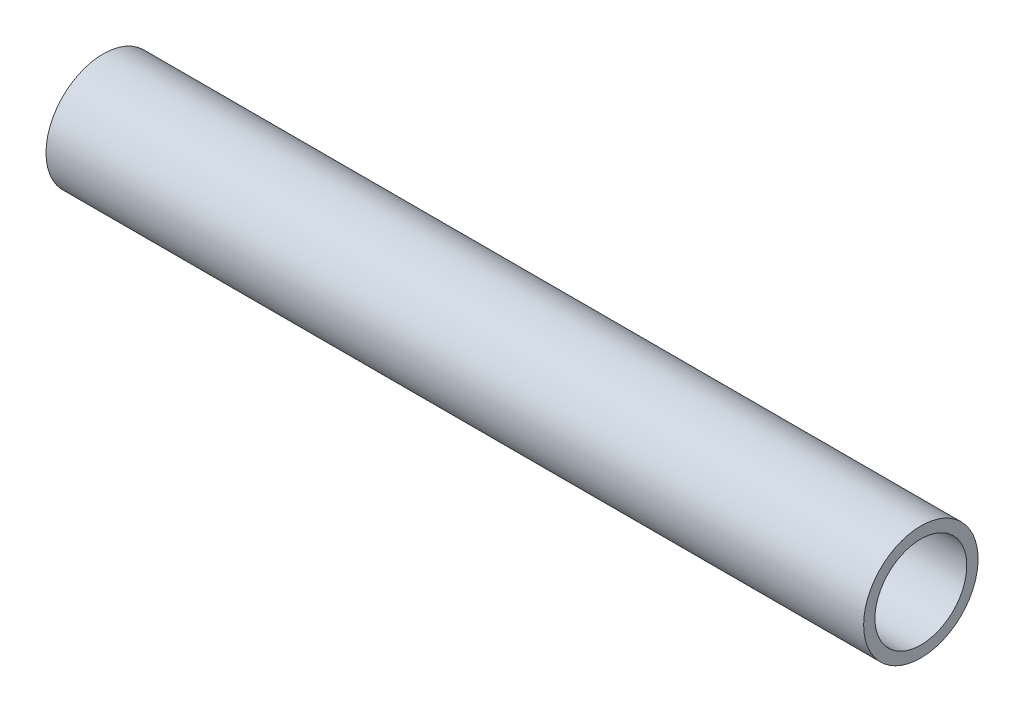
ISO-10303-21;
HEADER;
FILE_DESCRIPTION(('STEP AP214'),'2;1');
FILE_NAME('part.step','',(''),(''),'','','');
FILE_SCHEMA(('AUTOMOTIVE_DESIGN { 1 0 10303 214 1 1 1 1 }'));
ENDSEC;
DATA;
#1=APPLICATION_CONTEXT('core data for automotive mechanical design processes');
#2=APPLICATION_PROTOCOL_DEFINITION('international standard','automotive_design',2000,#1);
#3=PRODUCT_CONTEXT('',#1,'mechanical');
#4=PRODUCT('Part','Part','',(#3));
#5=PRODUCT_RELATED_PRODUCT_CATEGORY('part','',(#4));
#6=PRODUCT_DEFINITION_FORMATION('','',#4);
#7=PRODUCT_DEFINITION_CONTEXT('part definition',#1,'design');
#8=PRODUCT_DEFINITION('design','',#6,#7);
#9=PRODUCT_DEFINITION_SHAPE('','',#8);
#10=(LENGTH_UNIT() NAMED_UNIT(*) SI_UNIT(.MILLI.,.METRE.));
#11=(NAMED_UNIT(*) PLANE_ANGLE_UNIT() SI_UNIT($,.RADIAN.));
#12=(NAMED_UNIT(*) SI_UNIT($,.STERADIAN.) SOLID_ANGLE_UNIT());
#13=UNCERTAINTY_MEASURE_WITH_UNIT(LENGTH_MEASURE(1.E-05),#10,'distance_accuracy_value','');
#14=(GEOMETRIC_REPRESENTATION_CONTEXT(3) GLOBAL_UNCERTAINTY_ASSIGNED_CONTEXT((#13)) GLOBAL_UNIT_ASSIGNED_CONTEXT((#10,
#11,#12)) REPRESENTATION_CONTEXT('',''));
#15=CARTESIAN_POINT('',(0.,0.,0.));
#16=DIRECTION('',(0.,0.,1.));
#17=DIRECTION('',(1.,0.,0.));
#18=AXIS2_PLACEMENT_3D('',#15,#16,#17);
#19=CARTESIAN_POINT('',(76.2,0.,0.));
#20=DIRECTION('',(1.,0.,0.));
#21=DIRECTION('',(0.,0.,-1.));
#22=AXIS2_PLACEMENT_3D('',#19,#20,#21);
#23=PLANE('',#22);
#24=CARTESIAN_POINT('',(76.2,0.,0.));
#25=DIRECTION('',(1.,0.,0.));
#26=DIRECTION('',(0.,0.,-1.));
#27=AXIS2_PLACEMENT_3D('',#24,#25,#26);
#28=CIRCLE('',#27,10.668);
#29=CARTESIAN_POINT('',(76.2,0.,10.668));
#30=VERTEX_POINT('',#29);
#31=EDGE_CURVE('E10',#30,#30,#28,.T.);
#32=ORIENTED_EDGE('',*,*,#31,.T.);
#33=EDGE_LOOP('',(#32));
#34=FACE_BOUND('',#33,.T.);
#35=CARTESIAN_POINT('',(76.2,0.,0.));
#36=DIRECTION('',(1.,0.,0.));
#37=DIRECTION('',(0.,0.,-1.));
#38=AXIS2_PLACEMENT_3D('',#35,#36,#37);
#39=CIRCLE('',#38,8.5598);
#40=CARTESIAN_POINT('',(76.2,0.,8.5598));
#41=VERTEX_POINT('',#40);
#42=EDGE_CURVE('E42',#41,#41,#39,.T.);
#43=ORIENTED_EDGE('',*,*,#42,.F.);
#44=EDGE_LOOP('',(#43));
#45=FACE_BOUND('',#44,.T.);
#46=ADVANCED_FACE('F31',(#34,#45),#23,.T.);
#47=CARTESIAN_POINT('',(-76.2,0.,0.));
#48=DIRECTION('',(1.,0.,0.));
#49=DIRECTION('',(0.,0.,-1.));
#50=AXIS2_PLACEMENT_3D('',#47,#48,#49);
#51=PLANE('',#50);
#52=CARTESIAN_POINT('',(-76.2,0.,0.));
#53=DIRECTION('',(1.,0.,0.));
#54=DIRECTION('',(0.,0.,-1.));
#55=AXIS2_PLACEMENT_3D('',#52,#53,#54);
#56=CIRCLE('',#55,10.668);
#57=CARTESIAN_POINT('',(-76.2,0.,10.668));
#58=VERTEX_POINT('',#57);
#59=EDGE_CURVE('E35',#58,#58,#56,.T.);
#60=ORIENTED_EDGE('',*,*,#59,.F.);
#61=EDGE_LOOP('',(#60));
#62=FACE_BOUND('',#61,.T.);
#63=CARTESIAN_POINT('',(-76.2,0.,0.));
#64=DIRECTION('',(1.,0.,0.));
#65=DIRECTION('',(0.,0.,-1.));
#66=AXIS2_PLACEMENT_3D('',#63,#64,#65);
#67=CIRCLE('',#66,8.5598);
#68=CARTESIAN_POINT('',(-76.2,0.,8.5598));
#69=VERTEX_POINT('',#68);
#70=EDGE_CURVE('E44',#69,#69,#67,.T.);
#71=ORIENTED_EDGE('',*,*,#70,.T.);
#72=EDGE_LOOP('',(#71));
#73=FACE_BOUND('',#72,.T.);
#74=ADVANCED_FACE('F54',(#62,#73),#51,.F.);
#75=CARTESIAN_POINT('',(76.2,0.,0.));
#76=DIRECTION('',(-1.,0.,0.));
#77=DIRECTION('',(0.,0.,1.));
#78=AXIS2_PLACEMENT_3D('',#75,#76,#77);
#79=CYLINDRICAL_SURFACE('',#78,10.668);
#80=CARTESIAN_POINT('',(76.2,0.,10.668));
#81=CARTESIAN_POINT('',(74.6125,0.,10.668));
#82=CARTESIAN_POINT('',(73.025,0.,10.668));
#83=CARTESIAN_POINT('',(69.85,0.,10.668));
#84=CARTESIAN_POINT('',(68.2625,0.,10.668));
#85=CARTESIAN_POINT('',(65.0875,0.,10.668));
#86=CARTESIAN_POINT('',(63.5,0.,10.668));
#87=CARTESIAN_POINT('',(60.325,0.,10.668));
#88=CARTESIAN_POINT('',(58.7375,0.,10.668));
#89=CARTESIAN_POINT('',(55.5625,0.,10.668));
#90=CARTESIAN_POINT('',(53.975,0.,10.668));
#91=CARTESIAN_POINT('',(50.8,0.,10.668));
#92=CARTESIAN_POINT('',(49.2125,0.,10.668));
#93=CARTESIAN_POINT('',(46.0375,0.,10.668));
#94=CARTESIAN_POINT('',(44.45,0.,10.668));
#95=CARTESIAN_POINT('',(41.275,0.,10.668));
#96=CARTESIAN_POINT('',(39.6875,0.,10.668));
#97=CARTESIAN_POINT('',(36.5125,0.,10.668));
#98=CARTESIAN_POINT('',(34.925,0.,10.668));
#99=CARTESIAN_POINT('',(31.75,0.,10.668));
#100=CARTESIAN_POINT('',(30.1625,0.,10.668));
#101=CARTESIAN_POINT('',(26.9875,0.,10.668));
#102=CARTESIAN_POINT('',(25.4,0.,10.668));
#103=CARTESIAN_POINT('',(22.225,0.,10.668));
#104=CARTESIAN_POINT('',(20.6375,0.,10.668));
#105=CARTESIAN_POINT('',(17.4625,0.,10.668));
#106=CARTESIAN_POINT('',(15.875,0.,10.668));
#107=CARTESIAN_POINT('',(12.7,0.,10.668));
#108=CARTESIAN_POINT('',(11.1125,0.,10.668));
#109=CARTESIAN_POINT('',(7.93749999999999,0.,10.668));
#110=CARTESIAN_POINT('',(6.34999999999999,0.,10.668));
#111=CARTESIAN_POINT('',(3.17499999999999,0.,10.668));
#112=CARTESIAN_POINT('',(1.58749999999999,0.,10.668));
#113=CARTESIAN_POINT('',(-1.58750000000001,0.,10.668));
#114=CARTESIAN_POINT('',(-3.17500000000002,0.,10.668));
#115=CARTESIAN_POINT('',(-6.35000000000002,0.,10.668));
#116=CARTESIAN_POINT('',(-7.93750000000002,0.,10.668));
#117=CARTESIAN_POINT('',(-11.1125,0.,10.668));
#118=CARTESIAN_POINT('',(-12.7,0.,10.668));
#119=CARTESIAN_POINT('',(-15.875,0.,10.668));
#120=CARTESIAN_POINT('',(-17.4625,0.,10.668));
#121=CARTESIAN_POINT('',(-20.6375,0.,10.668));
#122=CARTESIAN_POINT('',(-22.225,0.,10.668));
#123=CARTESIAN_POINT('',(-25.4,0.,10.668));
#124=CARTESIAN_POINT('',(-26.9875,0.,10.668));
#125=CARTESIAN_POINT('',(-30.1625,0.,10.668));
#126=CARTESIAN_POINT('',(-31.75,0.,10.668));
#127=CARTESIAN_POINT('',(-34.925,0.,10.668));
#128=CARTESIAN_POINT('',(-36.5125,0.,10.668));
#129=CARTESIAN_POINT('',(-39.6875,0.,10.668));
#130=CARTESIAN_POINT('',(-41.275,0.,10.668));
#131=CARTESIAN_POINT('',(-44.45,0.,10.668));
#132=CARTESIAN_POINT('',(-46.0375,0.,10.668));
#133=CARTESIAN_POINT('',(-49.2125,0.,10.668));
#134=CARTESIAN_POINT('',(-50.8,0.,10.668));
#135=CARTESIAN_POINT('',(-53.975,0.,10.668));
#136=CARTESIAN_POINT('',(-55.5625,0.,10.668));
#137=CARTESIAN_POINT('',(-58.7375,0.,10.668));
#138=CARTESIAN_POINT('',(-60.325,0.,10.668));
#139=CARTESIAN_POINT('',(-63.5,0.,10.668));
#140=CARTESIAN_POINT('',(-65.0875,0.,10.668));
#141=CARTESIAN_POINT('',(-68.2625,0.,10.668));
#142=CARTESIAN_POINT('',(-69.85,0.,10.668));
#143=CARTESIAN_POINT('',(-73.025,0.,10.668));
#144=CARTESIAN_POINT('',(-74.6125,0.,10.668));
#145=CARTESIAN_POINT('',(-76.2,0.,10.668));
#146=B_SPLINE_CURVE_WITH_KNOTS('',3,(#80,#81,#82,#83,#84,#85,#86,#87,#88,#89,#90,#91,#92,#93,
#94,#95,#96,#97,#98,#99,#100,#101,#102,#103,#104,#105,#106,#107,#108,#109,#110,#111,#112,#113,
#114,#115,#116,#117,#118,#119,#120,#121,#122,#123,#124,#125,#126,#127,#128,#129,#130,#131,#132,
#133,#134,#135,#136,#137,#138,#139,#140,#141,#142,#143,#144,#145),.UNSPECIFIED.,.F.,.F.,(4,2,2,
2,2,2,2,2,2,2,2,2,2,2,2,2,2,2,2,2,2,2,2,2,2,2,2,2,2,2,2,2,4),(0.,4.76249999999999,
9.52499999999999,14.2875,19.05,23.8125,28.575,33.3375,38.1,42.8625,47.625,52.3875,57.15,61.9125,
66.675,71.4375,76.2,80.9625,85.725,90.4875,95.25,100.0125,104.775,109.5375,114.3,119.0625,
123.825,128.5875,133.35,138.1125,142.875,147.6375,152.4),.UNSPECIFIED.);
#147=EDGE_CURVE('BSEAM33',#30,#58,#146,.T.);
#148=ORIENTED_EDGE('',*,*,#31,.F.);
#149=ORIENTED_EDGE('',*,*,#59,.T.);
#150=ORIENTED_EDGE('',*,*,#147,.T.);
#151=ORIENTED_EDGE('',*,*,#147,.F.);
#152=EDGE_LOOP('',(#148,#150,#149,#151));
#153=FACE_BOUND('',#152,.T.);
#154=ADVANCED_FACE('F33',(#153),#79,.T.);
#155=CARTESIAN_POINT('',(76.2,0.,0.));
#156=DIRECTION('',(-1.,0.,0.));
#157=DIRECTION('',(0.,0.,1.));
#158=AXIS2_PLACEMENT_3D('',#155,#156,#157);
#159=CYLINDRICAL_SURFACE('',#158,8.5598);
#160=CARTESIAN_POINT('',(76.2,0.,8.5598));
#161=CARTESIAN_POINT('',(74.6125,0.,8.5598));
#162=CARTESIAN_POINT('',(73.025,0.,8.5598));
#163=CARTESIAN_POINT('',(69.85,0.,8.5598));
#164=CARTESIAN_POINT('',(68.2625,0.,8.5598));
#165=CARTESIAN_POINT('',(65.0875,0.,8.5598));
#166=CARTESIAN_POINT('',(63.5,0.,8.5598));
#167=CARTESIAN_POINT('',(60.325,0.,8.5598));
#168=CARTESIAN_POINT('',(58.7375,0.,8.5598));
#169=CARTESIAN_POINT('',(55.5625,0.,8.5598));
#170=CARTESIAN_POINT('',(53.975,0.,8.5598));
#171=CARTESIAN_POINT('',(50.8,0.,8.5598));
#172=CARTESIAN_POINT('',(49.2125,0.,8.5598));
#173=CARTESIAN_POINT('',(46.0375,0.,8.5598));
#174=CARTESIAN_POINT('',(44.45,0.,8.5598));
#175=CARTESIAN_POINT('',(41.275,0.,8.5598));
#176=CARTESIAN_POINT('',(39.6875,0.,8.5598));
#177=CARTESIAN_POINT('',(36.5125,0.,8.5598));
#178=CARTESIAN_POINT('',(34.925,0.,8.5598));
#179=CARTESIAN_POINT('',(31.75,0.,8.5598));
#180=CARTESIAN_POINT('',(30.1625,0.,8.5598));
#181=CARTESIAN_POINT('',(26.9875,0.,8.5598));
#182=CARTESIAN_POINT('',(25.4,0.,8.5598));
#183=CARTESIAN_POINT('',(22.225,0.,8.5598));
#184=CARTESIAN_POINT('',(20.6375,0.,8.5598));
#185=CARTESIAN_POINT('',(17.4625,0.,8.5598));
#186=CARTESIAN_POINT('',(15.875,0.,8.5598));
#187=CARTESIAN_POINT('',(12.7,0.,8.5598));
#188=CARTESIAN_POINT('',(11.1125,0.,8.5598));
#189=CARTESIAN_POINT('',(7.93749999999999,0.,8.5598));
#190=CARTESIAN_POINT('',(6.34999999999999,0.,8.5598));
#191=CARTESIAN_POINT('',(3.17499999999999,0.,8.5598));
#192=CARTESIAN_POINT('',(1.58749999999999,0.,8.5598));
#193=CARTESIAN_POINT('',(-1.58750000000001,0.,8.5598));
#194=CARTESIAN_POINT('',(-3.17500000000002,0.,8.5598));
#195=CARTESIAN_POINT('',(-6.35000000000002,0.,8.5598));
#196=CARTESIAN_POINT('',(-7.93750000000002,0.,8.5598));
#197=CARTESIAN_POINT('',(-11.1125,0.,8.5598));
#198=CARTESIAN_POINT('',(-12.7,0.,8.5598));
#199=CARTESIAN_POINT('',(-15.875,0.,8.5598));
#200=CARTESIAN_POINT('',(-17.4625,0.,8.5598));
#201=CARTESIAN_POINT('',(-20.6375,0.,8.5598));
#202=CARTESIAN_POINT('',(-22.225,0.,8.5598));
#203=CARTESIAN_POINT('',(-25.4,0.,8.5598));
#204=CARTESIAN_POINT('',(-26.9875,0.,8.5598));
#205=CARTESIAN_POINT('',(-30.1625,0.,8.5598));
#206=CARTESIAN_POINT('',(-31.75,0.,8.5598));
#207=CARTESIAN_POINT('',(-34.925,0.,8.5598));
#208=CARTESIAN_POINT('',(-36.5125,0.,8.5598));
#209=CARTESIAN_POINT('',(-39.6875,0.,8.5598));
#210=CARTESIAN_POINT('',(-41.275,0.,8.5598));
#211=CARTESIAN_POINT('',(-44.45,0.,8.5598));
#212=CARTESIAN_POINT('',(-46.0375,0.,8.5598));
#213=CARTESIAN_POINT('',(-49.2125,0.,8.5598));
#214=CARTESIAN_POINT('',(-50.8,0.,8.5598));
#215=CARTESIAN_POINT('',(-53.975,0.,8.5598));
#216=CARTESIAN_POINT('',(-55.5625,0.,8.5598));
#217=CARTESIAN_POINT('',(-58.7375,0.,8.5598));
#218=CARTESIAN_POINT('',(-60.325,0.,8.5598));
#219=CARTESIAN_POINT('',(-63.5,0.,8.5598));
#220=CARTESIAN_POINT('',(-65.0875,0.,8.5598));
#221=CARTESIAN_POINT('',(-68.2625,0.,8.5598));
#222=CARTESIAN_POINT('',(-69.85,0.,8.5598));
#223=CARTESIAN_POINT('',(-73.025,0.,8.5598));
#224=CARTESIAN_POINT('',(-74.6125,0.,8.5598));
#225=CARTESIAN_POINT('',(-76.2,0.,8.5598));
#226=B_SPLINE_CURVE_WITH_KNOTS('',3,(#160,#161,#162,#163,#164,#165,#166,#167,#168,#169,#170,
#171,#172,#173,#174,#175,#176,#177,#178,#179,#180,#181,#182,#183,#184,#185,#186,#187,#188,#189,
#190,#191,#192,#193,#194,#195,#196,#197,#198,#199,#200,#201,#202,#203,#204,#205,#206,#207,#208,
#209,#210,#211,#212,#213,#214,#215,#216,#217,#218,#219,#220,#221,#222,#223,#224,#225),
.UNSPECIFIED.,.F.,.F.,(4,2,2,2,2,2,2,2,2,2,2,2,2,2,2,2,2,2,2,2,2,2,2,2,2,2,2,2,2,2,2,2,4),(0.,
4.76249999999999,9.52499999999999,14.2875,19.05,23.8125,28.575,33.3375,38.1,42.8625,47.625,
52.3875,57.15,61.9125,66.675,71.4375,76.2,80.9625,85.725,90.4875,95.25,100.0125,104.775,
109.5375,114.3,119.0625,123.825,128.5875,133.35,138.1125,142.875,147.6375,152.4),.UNSPECIFIED.);
#227=EDGE_CURVE('BSEAM50',#41,#69,#226,.T.);
#228=ORIENTED_EDGE('',*,*,#42,.T.);
#229=ORIENTED_EDGE('',*,*,#70,.F.);
#230=ORIENTED_EDGE('',*,*,#227,.T.);
#231=ORIENTED_EDGE('',*,*,#227,.F.);
#232=EDGE_LOOP('',(#228,#230,#229,#231));
#233=FACE_BOUND('',#232,.T.);
#234=ADVANCED_FACE('F50',(#233),#159,.F.);
#235=CLOSED_SHELL('',(#46,#74,#154,#234));
#236=MANIFOLD_SOLID_BREP('B2',#235);
#237=ADVANCED_BREP_SHAPE_REPRESENTATION('',(#18,#236),#14);
#238=SHAPE_DEFINITION_REPRESENTATION(#9,#237);
ENDSEC;
END-ISO-10303-21;
